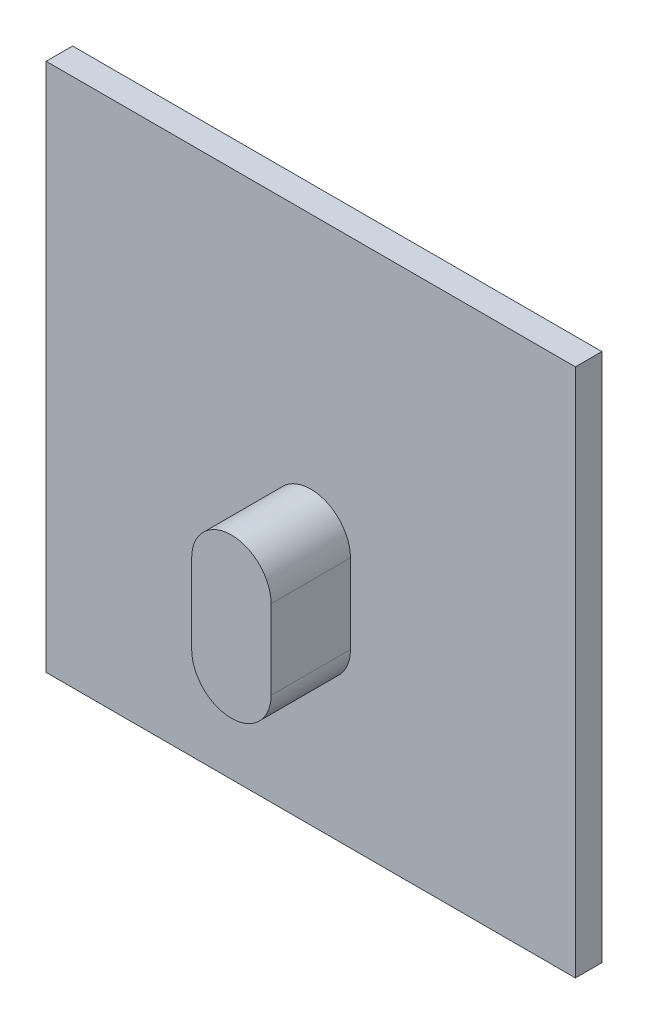
ISO-10303-21;
HEADER;
FILE_DESCRIPTION(('STEP AP214'),'2;1');
FILE_NAME('part.step','',(''),(''),'','','');
FILE_SCHEMA(('AUTOMOTIVE_DESIGN { 1 0 10303 214 1 1 1 1 }'));
ENDSEC;
DATA;
#1=APPLICATION_CONTEXT('core data for automotive mechanical design processes');
#2=APPLICATION_PROTOCOL_DEFINITION('international standard','automotive_design',2000,#1);
#3=PRODUCT_CONTEXT('',#1,'mechanical');
#4=PRODUCT('Part','Part','',(#3));
#5=PRODUCT_RELATED_PRODUCT_CATEGORY('part','',(#4));
#6=PRODUCT_DEFINITION_FORMATION('','',#4);
#7=PRODUCT_DEFINITION_CONTEXT('part definition',#1,'design');
#8=PRODUCT_DEFINITION('design','',#6,#7);
#9=PRODUCT_DEFINITION_SHAPE('','',#8);
#10=(LENGTH_UNIT() NAMED_UNIT(*) SI_UNIT(.MILLI.,.METRE.));
#11=(NAMED_UNIT(*) PLANE_ANGLE_UNIT() SI_UNIT($,.RADIAN.));
#12=(NAMED_UNIT(*) SI_UNIT($,.STERADIAN.) SOLID_ANGLE_UNIT());
#13=UNCERTAINTY_MEASURE_WITH_UNIT(LENGTH_MEASURE(1.E-05),#10,'distance_accuracy_value','');
#14=(GEOMETRIC_REPRESENTATION_CONTEXT(3) GLOBAL_UNCERTAINTY_ASSIGNED_CONTEXT((#13)) GLOBAL_UNIT_ASSIGNED_CONTEXT((#10,
#11,#12)) REPRESENTATION_CONTEXT('',''));
#15=CARTESIAN_POINT('',(0.,0.,0.));
#16=DIRECTION('',(0.,0.,1.));
#17=DIRECTION('',(1.,0.,0.));
#18=AXIS2_PLACEMENT_3D('',#15,#16,#17);
#19=CARTESIAN_POINT('',(0.,-20.0000000000001,2.));
#20=DIRECTION('',(0.,1.,0.));
#21=DIRECTION('',(0.,0.,1.));
#22=AXIS2_PLACEMENT_3D('',#19,#20,#21);
#23=PLANE('',#22);
#24=DIRECTION('',(1.,0.,0.));
#25=VECTOR('',#24,1.);
#26=CARTESIAN_POINT('',(0.,-20.0000000000001,0.));
#27=LINE('',#26,#25);
#28=CARTESIAN_POINT('',(-20.,-20.0000000000001,0.));
#29=VERTEX_POINT('',#28);
#30=CARTESIAN_POINT('',(20.,-20.0000000000001,0.));
#31=VERTEX_POINT('',#30);
#32=EDGE_CURVE('E108',#29,#31,#27,.T.);
#33=ORIENTED_EDGE('',*,*,#32,.T.);
#34=DIRECTION('',(0.,0.,-1.));
#35=VECTOR('',#34,1.);
#36=CARTESIAN_POINT('',(20.,-20.0000000000001,2.));
#37=LINE('',#36,#35);
#38=CARTESIAN_POINT('',(20.,-20.0000000000001,2.));
#39=VERTEX_POINT('',#38);
#40=EDGE_CURVE('E11',#39,#31,#37,.T.);
#41=ORIENTED_EDGE('',*,*,#40,.F.);
#42=DIRECTION('',(1.,0.,0.));
#43=VECTOR('',#42,1.);
#44=CARTESIAN_POINT('',(0.,-20.0000000000001,2.));
#45=LINE('',#44,#43);
#46=CARTESIAN_POINT('',(-20.,-20.0000000000001,2.));
#47=VERTEX_POINT('',#46);
#48=EDGE_CURVE('E93',#47,#39,#45,.T.);
#49=ORIENTED_EDGE('',*,*,#48,.F.);
#50=DIRECTION('',(0.,0.,-1.));
#51=VECTOR('',#50,1.);
#52=CARTESIAN_POINT('',(-20.,-20.0000000000001,2.));
#53=LINE('',#52,#51);
#54=EDGE_CURVE('E49',#47,#29,#53,.T.);
#55=ORIENTED_EDGE('',*,*,#54,.T.);
#56=EDGE_LOOP('',(#33,#41,#49,#55));
#57=FACE_BOUND('',#56,.T.);
#58=ADVANCED_FACE('F33',(#57),#23,.F.);
#59=CARTESIAN_POINT('',(20.,0.,2.));
#60=DIRECTION('',(-1.,0.,0.));
#61=DIRECTION('',(0.,0.,1.));
#62=AXIS2_PLACEMENT_3D('',#59,#60,#61);
#63=PLANE('',#62);
#64=DIRECTION('',(0.,1.,0.));
#65=VECTOR('',#64,1.);
#66=CARTESIAN_POINT('',(20.,0.,0.));
#67=LINE('',#66,#65);
#68=CARTESIAN_POINT('',(20.,19.9999999999999,0.));
#69=VERTEX_POINT('',#68);
#70=EDGE_CURVE('E99',#31,#69,#67,.T.);
#71=ORIENTED_EDGE('',*,*,#70,.T.);
#72=DIRECTION('',(0.,0.,-1.));
#73=VECTOR('',#72,1.);
#74=CARTESIAN_POINT('',(20.,19.9999999999999,2.));
#75=LINE('',#74,#73);
#76=CARTESIAN_POINT('',(20.,19.9999999999999,2.));
#77=VERTEX_POINT('',#76);
#78=EDGE_CURVE('E41',#77,#69,#75,.T.);
#79=ORIENTED_EDGE('',*,*,#78,.F.);
#80=DIRECTION('',(0.,1.,0.));
#81=VECTOR('',#80,1.);
#82=CARTESIAN_POINT('',(20.,0.,2.));
#83=LINE('',#82,#81);
#84=EDGE_CURVE('E87',#39,#77,#83,.T.);
#85=ORIENTED_EDGE('',*,*,#84,.F.);
#86=ORIENTED_EDGE('',*,*,#40,.T.);
#87=EDGE_LOOP('',(#71,#79,#85,#86));
#88=FACE_BOUND('',#87,.T.);
#89=ADVANCED_FACE('F98',(#88),#63,.F.);
#90=CARTESIAN_POINT('',(0.,19.9999999999999,2.));
#91=DIRECTION('',(0.,1.,0.));
#92=DIRECTION('',(0.,0.,1.));
#93=AXIS2_PLACEMENT_3D('',#90,#91,#92);
#94=PLANE('',#93);
#95=DIRECTION('',(1.,0.,0.));
#96=VECTOR('',#95,1.);
#97=CARTESIAN_POINT('',(0.,19.9999999999999,0.));
#98=LINE('',#97,#96);
#99=CARTESIAN_POINT('',(-20.,19.9999999999999,0.));
#100=VERTEX_POINT('',#99);
#101=EDGE_CURVE('E112',#100,#69,#98,.T.);
#102=ORIENTED_EDGE('',*,*,#101,.F.);
#103=DIRECTION('',(0.,0.,-1.));
#104=VECTOR('',#103,1.);
#105=CARTESIAN_POINT('',(-20.,19.9999999999999,2.));
#106=LINE('',#105,#104);
#107=CARTESIAN_POINT('',(-20.,19.9999999999999,2.));
#108=VERTEX_POINT('',#107);
#109=EDGE_CURVE('E64',#108,#100,#106,.T.);
#110=ORIENTED_EDGE('',*,*,#109,.F.);
#111=DIRECTION('',(1.,0.,0.));
#112=VECTOR('',#111,1.);
#113=CARTESIAN_POINT('',(0.,19.9999999999999,2.));
#114=LINE('',#113,#112);
#115=EDGE_CURVE('E92',#108,#77,#114,.T.);
#116=ORIENTED_EDGE('',*,*,#115,.T.);
#117=ORIENTED_EDGE('',*,*,#78,.T.);
#118=EDGE_LOOP('',(#102,#110,#116,#117));
#119=FACE_BOUND('',#118,.T.);
#120=ADVANCED_FACE('F102',(#119),#94,.T.);
#121=CARTESIAN_POINT('',(-20.,0.,2.));
#122=DIRECTION('',(-1.,0.,0.));
#123=DIRECTION('',(0.,0.,1.));
#124=AXIS2_PLACEMENT_3D('',#121,#122,#123);
#125=PLANE('',#124);
#126=DIRECTION('',(0.,1.,0.));
#127=VECTOR('',#126,1.);
#128=CARTESIAN_POINT('',(-20.,0.,0.));
#129=LINE('',#128,#127);
#130=EDGE_CURVE('E114',#29,#100,#129,.T.);
#131=ORIENTED_EDGE('',*,*,#130,.F.);
#132=ORIENTED_EDGE('',*,*,#54,.F.);
#133=DIRECTION('',(0.,1.,0.));
#134=VECTOR('',#133,1.);
#135=CARTESIAN_POINT('',(-20.,0.,2.));
#136=LINE('',#135,#134);
#137=EDGE_CURVE('E103',#47,#108,#136,.T.);
#138=ORIENTED_EDGE('',*,*,#137,.T.);
#139=ORIENTED_EDGE('',*,*,#109,.T.);
#140=EDGE_LOOP('',(#131,#132,#138,#139));
#141=FACE_BOUND('',#140,.T.);
#142=ADVANCED_FACE('F188',(#141),#125,.T.);
#143=CARTESIAN_POINT('',(0.,0.,2.));
#144=DIRECTION('',(0.,0.,1.));
#145=DIRECTION('',(1.,0.,0.));
#146=AXIS2_PLACEMENT_3D('',#143,#144,#145);
#147=PLANE('',#146);
#148=CARTESIAN_POINT('',(0.,-1.00000000000007,2.));
#149=DIRECTION('',(0.,0.,1.));
#150=DIRECTION('',(1.,0.,0.));
#151=AXIS2_PLACEMENT_3D('',#148,#149,#150);
#152=CIRCLE('',#151,3.);
#153=CARTESIAN_POINT('',(3.,-1.00000000000007,2.));
#154=VERTEX_POINT('',#153);
#155=CARTESIAN_POINT('',(-3.,-1.00000000000007,2.));
#156=VERTEX_POINT('',#155);
#157=EDGE_CURVE('E117',#154,#156,#152,.T.);
#158=ORIENTED_EDGE('',*,*,#157,.F.);
#159=DIRECTION('',(0.,-1.,0.));
#160=VECTOR('',#159,1.);
#161=CARTESIAN_POINT('',(3.,0.,2.));
#162=LINE('',#161,#160);
#163=CARTESIAN_POINT('',(3.,-7.00000000000007,2.));
#164=VERTEX_POINT('',#163);
#165=EDGE_CURVE('E121',#154,#164,#162,.T.);
#166=ORIENTED_EDGE('',*,*,#165,.T.);
#167=CARTESIAN_POINT('',(0.,-7.00000000000007,2.));
#168=DIRECTION('',(0.,0.,1.));
#169=DIRECTION('',(1.,0.,0.));
#170=AXIS2_PLACEMENT_3D('',#167,#168,#169);
#171=CIRCLE('',#170,3.);
#172=CARTESIAN_POINT('',(-3.,-7.00000000000007,2.));
#173=VERTEX_POINT('',#172);
#174=EDGE_CURVE('E129',#173,#164,#171,.T.);
#175=ORIENTED_EDGE('',*,*,#174,.F.);
#176=DIRECTION('',(0.,1.,0.));
#177=VECTOR('',#176,1.);
#178=CARTESIAN_POINT('',(-3.,0.,2.));
#179=LINE('',#178,#177);
#180=EDGE_CURVE('E135',#173,#156,#179,.T.);
#181=ORIENTED_EDGE('',*,*,#180,.T.);
#182=EDGE_LOOP('',(#158,#166,#175,#181));
#183=FACE_BOUND('',#182,.T.);
#184=ORIENTED_EDGE('',*,*,#48,.T.);
#185=ORIENTED_EDGE('',*,*,#84,.T.);
#186=ORIENTED_EDGE('',*,*,#115,.F.);
#187=ORIENTED_EDGE('',*,*,#137,.F.);
#188=EDGE_LOOP('',(#184,#185,#186,#187));
#189=FACE_BOUND('',#188,.T.);
#190=ADVANCED_FACE('F89',(#183,#189),#147,.T.);
#191=CARTESIAN_POINT('',(0.,0.,0.));
#192=DIRECTION('',(0.,0.,1.));
#193=DIRECTION('',(1.,0.,0.));
#194=AXIS2_PLACEMENT_3D('',#191,#192,#193);
#195=PLANE('',#194);
#196=ORIENTED_EDGE('',*,*,#32,.F.);
#197=ORIENTED_EDGE('',*,*,#130,.T.);
#198=ORIENTED_EDGE('',*,*,#101,.T.);
#199=ORIENTED_EDGE('',*,*,#70,.F.);
#200=EDGE_LOOP('',(#196,#197,#198,#199));
#201=FACE_BOUND('',#200,.T.);
#202=ADVANCED_FACE('F175',(#201),#195,.F.);
#203=CARTESIAN_POINT('',(0.,-1.00000000000007,8.));
#204=DIRECTION('',(0.,0.,-1.));
#205=DIRECTION('',(-1.,0.,0.));
#206=AXIS2_PLACEMENT_3D('',#203,#204,#205);
#207=CYLINDRICAL_SURFACE('',#206,3.);
#208=ORIENTED_EDGE('',*,*,#157,.T.);
#209=DIRECTION('',(0.,0.,-1.));
#210=VECTOR('',#209,1.);
#211=CARTESIAN_POINT('',(-3.,-1.00000000000007,8.));
#212=LINE('',#211,#210);
#213=CARTESIAN_POINT('',(-3.,-1.00000000000007,8.));
#214=VERTEX_POINT('',#213);
#215=EDGE_CURVE('E110',#214,#156,#212,.T.);
#216=ORIENTED_EDGE('',*,*,#215,.F.);
#217=CARTESIAN_POINT('',(0.,-1.00000000000007,8.));
#218=DIRECTION('',(0.,0.,1.));
#219=DIRECTION('',(1.,0.,0.));
#220=AXIS2_PLACEMENT_3D('',#217,#218,#219);
#221=CIRCLE('',#220,3.);
#222=CARTESIAN_POINT('',(3.,-1.00000000000007,8.));
#223=VERTEX_POINT('',#222);
#224=EDGE_CURVE('E164',#223,#214,#221,.T.);
#225=ORIENTED_EDGE('',*,*,#224,.F.);
#226=DIRECTION('',(0.,0.,-1.));
#227=VECTOR('',#226,1.);
#228=CARTESIAN_POINT('',(3.,-1.00000000000007,8.));
#229=LINE('',#228,#227);
#230=EDGE_CURVE('E155',#223,#154,#229,.T.);
#231=ORIENTED_EDGE('',*,*,#230,.T.);
#232=EDGE_LOOP('',(#208,#216,#225,#231));
#233=FACE_BOUND('',#232,.T.);
#234=ADVANCED_FACE('F173',(#233),#207,.T.);
#235=CARTESIAN_POINT('',(-3.,0.,8.));
#236=DIRECTION('',(-1.,0.,0.));
#237=DIRECTION('',(0.,-1.,0.));
#238=AXIS2_PLACEMENT_3D('',#235,#236,#237);
#239=PLANE('',#238);
#240=ORIENTED_EDGE('',*,*,#215,.T.);
#241=ORIENTED_EDGE('',*,*,#180,.F.);
#242=DIRECTION('',(0.,0.,-1.));
#243=VECTOR('',#242,1.);
#244=CARTESIAN_POINT('',(-3.,-7.00000000000007,8.));
#245=LINE('',#244,#243);
#246=CARTESIAN_POINT('',(-3.,-7.00000000000007,8.));
#247=VERTEX_POINT('',#246);
#248=EDGE_CURVE('E148',#247,#173,#245,.T.);
#249=ORIENTED_EDGE('',*,*,#248,.F.);
#250=DIRECTION('',(0.,1.,0.));
#251=VECTOR('',#250,1.);
#252=CARTESIAN_POINT('',(-3.,0.,8.));
#253=LINE('',#252,#251);
#254=EDGE_CURVE('E162',#247,#214,#253,.T.);
#255=ORIENTED_EDGE('',*,*,#254,.T.);
#256=EDGE_LOOP('',(#240,#241,#249,#255));
#257=FACE_BOUND('',#256,.T.);
#258=ADVANCED_FACE('F145',(#257),#239,.T.);
#259=CARTESIAN_POINT('',(0.,-7.00000000000007,8.));
#260=DIRECTION('',(0.,0.,-1.));
#261=DIRECTION('',(-1.,0.,0.));
#262=AXIS2_PLACEMENT_3D('',#259,#260,#261);
#263=CYLINDRICAL_SURFACE('',#262,3.);
#264=ORIENTED_EDGE('',*,*,#174,.T.);
#265=DIRECTION('',(0.,0.,-1.));
#266=VECTOR('',#265,1.);
#267=CARTESIAN_POINT('',(3.,-7.00000000000007,8.));
#268=LINE('',#267,#266);
#269=CARTESIAN_POINT('',(3.,-7.00000000000007,8.));
#270=VERTEX_POINT('',#269);
#271=EDGE_CURVE('E77',#270,#164,#268,.T.);
#272=ORIENTED_EDGE('',*,*,#271,.F.);
#273=CARTESIAN_POINT('',(0.,-7.00000000000007,8.));
#274=DIRECTION('',(0.,0.,1.));
#275=DIRECTION('',(1.,0.,0.));
#276=AXIS2_PLACEMENT_3D('',#273,#274,#275);
#277=CIRCLE('',#276,3.);
#278=EDGE_CURVE('E153',#247,#270,#277,.T.);
#279=ORIENTED_EDGE('',*,*,#278,.F.);
#280=ORIENTED_EDGE('',*,*,#248,.T.);
#281=EDGE_LOOP('',(#264,#272,#279,#280));
#282=FACE_BOUND('',#281,.T.);
#283=ADVANCED_FACE('F151',(#282),#263,.T.);
#284=CARTESIAN_POINT('',(3.,0.,8.));
#285=DIRECTION('',(1.,0.,0.));
#286=DIRECTION('',(0.,1.,0.));
#287=AXIS2_PLACEMENT_3D('',#284,#285,#286);
#288=PLANE('',#287);
#289=ORIENTED_EDGE('',*,*,#271,.T.);
#290=ORIENTED_EDGE('',*,*,#165,.F.);
#291=ORIENTED_EDGE('',*,*,#230,.F.);
#292=DIRECTION('',(0.,-1.,0.));
#293=VECTOR('',#292,1.);
#294=CARTESIAN_POINT('',(3.,0.,8.));
#295=LINE('',#294,#293);
#296=EDGE_CURVE('E159',#223,#270,#295,.T.);
#297=ORIENTED_EDGE('',*,*,#296,.T.);
#298=EDGE_LOOP('',(#289,#290,#291,#297));
#299=FACE_BOUND('',#298,.T.);
#300=ADVANCED_FACE('F253',(#299),#288,.T.);
#301=CARTESIAN_POINT('',(0.,0.,8.));
#302=DIRECTION('',(0.,0.,1.));
#303=DIRECTION('',(1.,0.,0.));
#304=AXIS2_PLACEMENT_3D('',#301,#302,#303);
#305=PLANE('',#304);
#306=ORIENTED_EDGE('',*,*,#224,.T.);
#307=ORIENTED_EDGE('',*,*,#254,.F.);
#308=ORIENTED_EDGE('',*,*,#278,.T.);
#309=ORIENTED_EDGE('',*,*,#296,.F.);
#310=EDGE_LOOP('',(#306,#307,#308,#309));
#311=FACE_BOUND('',#310,.T.);
#312=ADVANCED_FACE('F170',(#311),#305,.T.);
#313=CLOSED_SHELL('',(#58,#89,#120,#142,#190,#202,#234,#258,#283,#300,#312));
#314=MANIFOLD_SOLID_BREP('B2',#313);
#315=ADVANCED_BREP_SHAPE_REPRESENTATION('',(#18,#314),#14);
#316=SHAPE_DEFINITION_REPRESENTATION(#9,#315);
ENDSEC;
END-ISO-10303-21;
